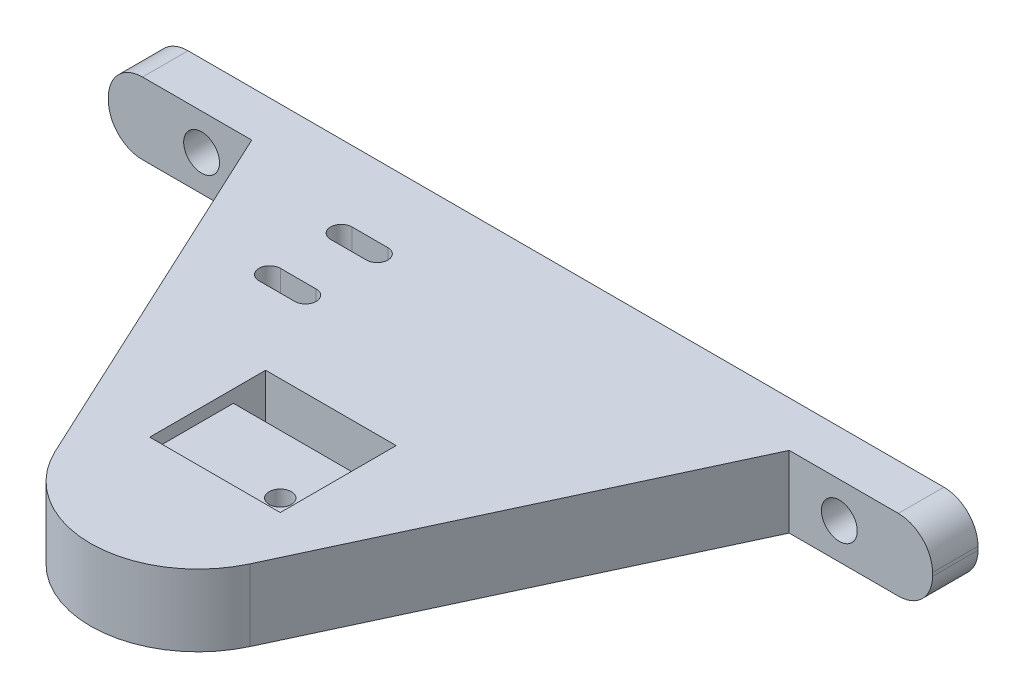
ISO-10303-21;
HEADER;
FILE_DESCRIPTION(('STEP AP214'),'2;1');
FILE_NAME('part.step','',(''),(''),'','','');
FILE_SCHEMA(('AUTOMOTIVE_DESIGN { 1 0 10303 214 1 1 1 1 }'));
ENDSEC;
DATA;
#1=APPLICATION_CONTEXT('core data for automotive mechanical design processes');
#2=APPLICATION_PROTOCOL_DEFINITION('international standard','automotive_design',2000,#1);
#3=PRODUCT_CONTEXT('',#1,'mechanical');
#4=PRODUCT('Part','Part','',(#3));
#5=PRODUCT_RELATED_PRODUCT_CATEGORY('part','',(#4));
#6=PRODUCT_DEFINITION_FORMATION('','',#4);
#7=PRODUCT_DEFINITION_CONTEXT('part definition',#1,'design');
#8=PRODUCT_DEFINITION('design','',#6,#7);
#9=PRODUCT_DEFINITION_SHAPE('','',#8);
#10=(LENGTH_UNIT() NAMED_UNIT(*) SI_UNIT(.MILLI.,.METRE.));
#11=(NAMED_UNIT(*) PLANE_ANGLE_UNIT() SI_UNIT($,.RADIAN.));
#12=(NAMED_UNIT(*) SI_UNIT($,.STERADIAN.) SOLID_ANGLE_UNIT());
#13=UNCERTAINTY_MEASURE_WITH_UNIT(LENGTH_MEASURE(1.E-05),#10,'distance_accuracy_value','');
#14=(GEOMETRIC_REPRESENTATION_CONTEXT(3) GLOBAL_UNCERTAINTY_ASSIGNED_CONTEXT((#13)) GLOBAL_UNIT_ASSIGNED_CONTEXT((#10,
#11,#12)) REPRESENTATION_CONTEXT('',''));
#15=CARTESIAN_POINT('',(0.,0.,0.));
#16=DIRECTION('',(0.,0.,1.));
#17=DIRECTION('',(1.,0.,0.));
#18=AXIS2_PLACEMENT_3D('',#15,#16,#17);
#19=CARTESIAN_POINT('',(0.,5.,6.35));
#20=DIRECTION('',(0.,1.,0.));
#21=DIRECTION('',(-1.,0.,0.));
#22=AXIS2_PLACEMENT_3D('',#19,#20,#21);
#23=PLANE('',#22);
#24=CARTESIAN_POINT('',(-20.000000062,5.00000000000001,11.35));
#25=DIRECTION('',(0.,1.,0.));
#26=DIRECTION('',(-1.,0.,0.));
#27=AXIS2_PLACEMENT_3D('',#24,#25,#26);
#28=CIRCLE('',#27,1.5);
#29=CARTESIAN_POINT('',(-20.000000062,5.00000000000001,9.85));
#30=VERTEX_POINT('',#29);
#31=CARTESIAN_POINT('',(-20.000000062,5.00000000000001,12.85));
#32=VERTEX_POINT('',#31);
#33=EDGE_CURVE('E51',#30,#32,#28,.T.);
#34=ORIENTED_EDGE('',*,*,#33,.F.);
#35=DIRECTION('',(-1.,0.,0.));
#36=VECTOR('',#35,1.);
#37=CARTESIAN_POINT('',(-20.000000062,5.00000000000001,9.85));
#38=LINE('',#37,#36);
#39=CARTESIAN_POINT('',(-15.000000062,5.00000000000001,9.85));
#40=VERTEX_POINT('',#39);
#41=EDGE_CURVE('E230',#40,#30,#38,.T.);
#42=ORIENTED_EDGE('',*,*,#41,.F.);
#43=CARTESIAN_POINT('',(-15.000000062,5.00000000000001,11.35));
#44=DIRECTION('',(0.,1.,0.));
#45=DIRECTION('',(-1.,0.,0.));
#46=AXIS2_PLACEMENT_3D('',#43,#44,#45);
#47=CIRCLE('',#46,1.5);
#48=CARTESIAN_POINT('',(-15.000000062,5.00000000000001,12.85));
#49=VERTEX_POINT('',#48);
#50=EDGE_CURVE('E233',#49,#40,#47,.T.);
#51=ORIENTED_EDGE('',*,*,#50,.F.);
#52=DIRECTION('',(1.,0.,0.));
#53=VECTOR('',#52,1.);
#54=CARTESIAN_POINT('',(-20.000000062,5.00000000000001,12.85));
#55=LINE('',#54,#53);
#56=EDGE_CURVE('E239',#32,#49,#55,.T.);
#57=ORIENTED_EDGE('',*,*,#56,.F.);
#58=EDGE_LOOP('',(#34,#42,#51,#57));
#59=FACE_BOUND('',#58,.T.);
#60=CARTESIAN_POINT('',(-20.000000062,5.00000000000001,21.35));
#61=DIRECTION('',(0.,1.,0.));
#62=DIRECTION('',(-1.,0.,0.));
#63=AXIS2_PLACEMENT_3D('',#60,#61,#62);
#64=CIRCLE('',#63,1.5);
#65=CARTESIAN_POINT('',(-20.000000062,5.00000000000001,19.85));
#66=VERTEX_POINT('',#65);
#67=CARTESIAN_POINT('',(-20.000000062,5.00000000000001,22.85));
#68=VERTEX_POINT('',#67);
#69=EDGE_CURVE('E59',#66,#68,#64,.T.);
#70=ORIENTED_EDGE('',*,*,#69,.F.);
#71=DIRECTION('',(-1.,0.,0.));
#72=VECTOR('',#71,1.);
#73=CARTESIAN_POINT('',(-20.000000062,5.00000000000001,19.85));
#74=LINE('',#73,#72);
#75=CARTESIAN_POINT('',(-15.000000062,5.00000000000001,19.85));
#76=VERTEX_POINT('',#75);
#77=EDGE_CURVE('E254',#76,#66,#74,.T.);
#78=ORIENTED_EDGE('',*,*,#77,.F.);
#79=CARTESIAN_POINT('',(-15.000000062,5.00000000000001,21.35));
#80=DIRECTION('',(0.,1.,0.));
#81=DIRECTION('',(-1.,0.,0.));
#82=AXIS2_PLACEMENT_3D('',#79,#80,#81);
#83=CIRCLE('',#82,1.5);
#84=CARTESIAN_POINT('',(-15.000000062,5.00000000000001,22.85));
#85=VERTEX_POINT('',#84);
#86=EDGE_CURVE('E268',#85,#76,#83,.T.);
#87=ORIENTED_EDGE('',*,*,#86,.F.);
#88=DIRECTION('',(1.,0.,0.));
#89=VECTOR('',#88,1.);
#90=CARTESIAN_POINT('',(-20.000000062,5.00000000000001,22.85));
#91=LINE('',#90,#89);
#92=EDGE_CURVE('E265',#68,#85,#91,.T.);
#93=ORIENTED_EDGE('',*,*,#92,.F.);
#94=EDGE_LOOP('',(#70,#78,#87,#93));
#95=FACE_BOUND('',#94,.T.);
#96=DIRECTION('',(1.,0.,0.));
#97=VECTOR('',#96,1.);
#98=CARTESIAN_POINT('',(0.,5.,6.35));
#99=LINE('',#98,#97);
#100=CARTESIAN_POINT('',(37.500000062,4.99999999999999,6.35));
#101=VERTEX_POINT('',#100);
#102=CARTESIAN_POINT('',(52.737500062,4.99999999999998,6.35));
#103=VERTEX_POINT('',#102);
#104=EDGE_CURVE('E373',#101,#103,#99,.T.);
#105=ORIENTED_EDGE('',*,*,#104,.T.);
#106=DIRECTION('',(0.,0.,-1.));
#107=VECTOR('',#106,1.);
#108=CARTESIAN_POINT('',(52.737500062,4.99999999999998,0.));
#109=LINE('',#108,#107);
#110=CARTESIAN_POINT('',(52.737500062,4.99999999999998,0.));
#111=VERTEX_POINT('',#110);
#112=EDGE_CURVE('E11',#103,#111,#109,.T.);
#113=ORIENTED_EDGE('',*,*,#112,.T.);
#114=DIRECTION('',(1.,0.,0.));
#115=VECTOR('',#114,1.);
#116=CARTESIAN_POINT('',(0.,5.,0.));
#117=LINE('',#116,#115);
#118=CARTESIAN_POINT('',(-52.737500062,5.00000000000002,0.));
#119=VERTEX_POINT('',#118);
#120=EDGE_CURVE('E385',#119,#111,#117,.T.);
#121=ORIENTED_EDGE('',*,*,#120,.F.);
#122=DIRECTION('',(0.,0.,-1.));
#123=VECTOR('',#122,1.);
#124=CARTESIAN_POINT('',(-52.737500062,5.00000000000002,6.35));
#125=LINE('',#124,#123);
#126=CARTESIAN_POINT('',(-52.737500062,5.00000000000002,6.35));
#127=VERTEX_POINT('',#126);
#128=EDGE_CURVE('E44',#119,#127,#125,.F.);
#129=ORIENTED_EDGE('',*,*,#128,.T.);
#130=CARTESIAN_POINT('',(-37.500000062,5.00000000000002,6.35));
#131=VERTEX_POINT('',#130);
#132=EDGE_CURVE('E374',#127,#131,#99,.T.);
#133=ORIENTED_EDGE('',*,*,#132,.T.);
#134=DIRECTION('',(-0.422117577561382,0.,-0.906541091574844));
#135=VECTOR('',#134,1.);
#136=CARTESIAN_POINT('',(-33.2480632052667,5.00000000000002,15.4814735142717));
#137=LINE('',#136,#135);
#138=CARTESIAN_POINT('',(-13.5981163736227,5.00000000000001,57.6817636634207));
#139=VERTEX_POINT('',#138);
#140=EDGE_CURVE('E349',#139,#131,#137,.T.);
#141=ORIENTED_EDGE('',*,*,#140,.F.);
#142=CARTESIAN_POINT('',(0.,5.,51.35));
#143=DIRECTION('',(0.,1.,0.));
#144=DIRECTION('',(-1.,0.,0.));
#145=AXIS2_PLACEMENT_3D('',#142,#143,#144);
#146=CIRCLE('',#145,15.);
#147=CARTESIAN_POINT('',(13.5981163736227,5.,57.6817636634207));
#148=VERTEX_POINT('',#147);
#149=EDGE_CURVE('E340',#139,#148,#146,.T.);
#150=ORIENTED_EDGE('',*,*,#149,.T.);
#151=DIRECTION('',(0.422117577561382,0.,-0.906541091574844));
#152=VECTOR('',#151,1.);
#153=CARTESIAN_POINT('',(33.2480632052667,4.99999999999999,15.4814735142717));
#154=LINE('',#153,#152);
#155=EDGE_CURVE('E350',#148,#101,#154,.T.);
#156=ORIENTED_EDGE('',*,*,#155,.T.);
#157=EDGE_LOOP('',(#105,#113,#121,#129,#133,#141,#150,#156));
#158=FACE_BOUND('',#157,.T.);
#159=DIRECTION('',(0.,0.,-1.));
#160=VECTOR('',#159,1.);
#161=CARTESIAN_POINT('',(-8.715,5.,0.));
#162=LINE('',#161,#160);
#163=CARTESIAN_POINT('',(-8.715,5.,49.375));
#164=VERTEX_POINT('',#163);
#165=CARTESIAN_POINT('',(-8.715,5.,33.195));
#166=VERTEX_POINT('',#165);
#167=EDGE_CURVE('E328',#164,#166,#162,.T.);
#168=ORIENTED_EDGE('',*,*,#167,.T.);
#169=DIRECTION('',(1.,0.,0.));
#170=VECTOR('',#169,1.);
#171=CARTESIAN_POINT('',(0.,5.,33.195));
#172=LINE('',#171,#170);
#173=CARTESIAN_POINT('',(9.505,5.,33.195));
#174=VERTEX_POINT('',#173);
#175=EDGE_CURVE('E290',#166,#174,#172,.T.);
#176=ORIENTED_EDGE('',*,*,#175,.T.);
#177=DIRECTION('',(0.,0.,1.));
#178=VECTOR('',#177,1.);
#179=CARTESIAN_POINT('',(9.505,5.,0.));
#180=LINE('',#179,#178);
#181=CARTESIAN_POINT('',(9.505,5.,49.375));
#182=VERTEX_POINT('',#181);
#183=EDGE_CURVE('E305',#174,#182,#180,.T.);
#184=ORIENTED_EDGE('',*,*,#183,.T.);
#185=DIRECTION('',(-1.,0.,0.));
#186=VECTOR('',#185,1.);
#187=CARTESIAN_POINT('',(0.,5.,49.375));
#188=LINE('',#187,#186);
#189=EDGE_CURVE('E317',#182,#164,#188,.T.);
#190=ORIENTED_EDGE('',*,*,#189,.T.);
#191=EDGE_LOOP('',(#168,#176,#184,#190));
#192=FACE_BOUND('',#191,.T.);
#193=ADVANCED_FACE('F36',(#59,#95,#158,#192),#23,.T.);
#194=CARTESIAN_POINT('',(0.,-4.99999999999998,6.35));
#195=DIRECTION('',(0.,1.,0.));
#196=DIRECTION('',(0.,0.,1.));
#197=AXIS2_PLACEMENT_3D('',#194,#195,#196);
#198=PLANE('',#197);
#199=DIRECTION('',(-1.,0.,0.));
#200=VECTOR('',#199,1.);
#201=CARTESIAN_POINT('',(-20.000000062,-5.00000000000004,9.85));
#202=LINE('',#201,#200);
#203=CARTESIAN_POINT('',(-15.000000062,-5.00000000000004,9.85));
#204=VERTEX_POINT('',#203);
#205=CARTESIAN_POINT('',(-20.000000062,-5.00000000000004,9.85));
#206=VERTEX_POINT('',#205);
#207=EDGE_CURVE('E217',#204,#206,#202,.T.);
#208=ORIENTED_EDGE('',*,*,#207,.T.);
#209=CARTESIAN_POINT('',(-20.000000062,-5.00000000000004,11.35));
#210=DIRECTION('',(0.,1.,0.));
#211=DIRECTION('',(-1.,0.,0.));
#212=AXIS2_PLACEMENT_3D('',#209,#210,#211);
#213=CIRCLE('',#212,1.5);
#214=CARTESIAN_POINT('',(-20.000000062,-5.00000000000004,12.85));
#215=VERTEX_POINT('',#214);
#216=EDGE_CURVE('E211',#206,#215,#213,.T.);
#217=ORIENTED_EDGE('',*,*,#216,.T.);
#218=DIRECTION('',(1.,0.,0.));
#219=VECTOR('',#218,1.);
#220=CARTESIAN_POINT('',(-20.000000062,-5.00000000000004,12.85));
#221=LINE('',#220,#219);
#222=CARTESIAN_POINT('',(-15.000000062,-4.99999999999998,12.85));
#223=VERTEX_POINT('',#222);
#224=EDGE_CURVE('E221',#215,#223,#221,.T.);
#225=ORIENTED_EDGE('',*,*,#224,.T.);
#226=CARTESIAN_POINT('',(-15.000000062,-5.00000000000004,11.35));
#227=DIRECTION('',(0.,1.,0.));
#228=DIRECTION('',(-1.,0.,0.));
#229=AXIS2_PLACEMENT_3D('',#226,#227,#228);
#230=CIRCLE('',#229,1.5);
#231=EDGE_CURVE('E225',#223,#204,#230,.T.);
#232=ORIENTED_EDGE('',*,*,#231,.T.);
#233=EDGE_LOOP('',(#208,#217,#225,#232));
#234=FACE_BOUND('',#233,.T.);
#235=DIRECTION('',(-1.,0.,0.));
#236=VECTOR('',#235,1.);
#237=CARTESIAN_POINT('',(-20.000000062,-5.00000000000004,19.85));
#238=LINE('',#237,#236);
#239=CARTESIAN_POINT('',(-15.000000062,-5.00000000000004,19.85));
#240=VERTEX_POINT('',#239);
#241=CARTESIAN_POINT('',(-20.000000062,-5.00000000000004,19.85));
#242=VERTEX_POINT('',#241);
#243=EDGE_CURVE('E260',#240,#242,#238,.T.);
#244=ORIENTED_EDGE('',*,*,#243,.T.);
#245=CARTESIAN_POINT('',(-20.000000062,-5.00000000000004,21.35));
#246=DIRECTION('',(0.,1.,0.));
#247=DIRECTION('',(-1.,0.,0.));
#248=AXIS2_PLACEMENT_3D('',#245,#246,#247);
#249=CIRCLE('',#248,1.5);
#250=CARTESIAN_POINT('',(-20.000000062,-5.00000000000004,22.85));
#251=VERTEX_POINT('',#250);
#252=EDGE_CURVE('E250',#242,#251,#249,.T.);
#253=ORIENTED_EDGE('',*,*,#252,.T.);
#254=DIRECTION('',(1.,0.,0.));
#255=VECTOR('',#254,1.);
#256=CARTESIAN_POINT('',(-20.000000062,-5.00000000000004,22.85));
#257=LINE('',#256,#255);
#258=CARTESIAN_POINT('',(-15.000000062,-4.99999999999998,22.85));
#259=VERTEX_POINT('',#258);
#260=EDGE_CURVE('E253',#251,#259,#257,.T.);
#261=ORIENTED_EDGE('',*,*,#260,.T.);
#262=CARTESIAN_POINT('',(-15.000000062,-5.00000000000004,21.35));
#263=DIRECTION('',(0.,1.,0.));
#264=DIRECTION('',(-1.,0.,0.));
#265=AXIS2_PLACEMENT_3D('',#262,#263,#264);
#266=CIRCLE('',#265,1.5);
#267=EDGE_CURVE('E257',#259,#240,#266,.T.);
#268=ORIENTED_EDGE('',*,*,#267,.T.);
#269=EDGE_LOOP('',(#244,#253,#261,#268));
#270=FACE_BOUND('',#269,.T.);
#271=DIRECTION('',(1.,0.,0.));
#272=VECTOR('',#271,1.);
#273=CARTESIAN_POINT('',(0.,-4.99999999999998,6.35));
#274=LINE('',#273,#272);
#275=CARTESIAN_POINT('',(-52.737500062,-4.99999999999998,6.35));
#276=VERTEX_POINT('',#275);
#277=CARTESIAN_POINT('',(-37.500000062,-4.99999999999998,6.35));
#278=VERTEX_POINT('',#277);
#279=EDGE_CURVE('E367',#276,#278,#274,.T.);
#280=ORIENTED_EDGE('',*,*,#279,.F.);
#281=DIRECTION('',(0.,0.,-1.));
#282=VECTOR('',#281,1.);
#283=CARTESIAN_POINT('',(-52.737500062,-4.99999999999998,0.));
#284=LINE('',#283,#282);
#285=CARTESIAN_POINT('',(-52.737500062,-4.99999999999998,0.));
#286=VERTEX_POINT('',#285);
#287=EDGE_CURVE('E394',#276,#286,#284,.T.);
#288=ORIENTED_EDGE('',*,*,#287,.T.);
#289=DIRECTION('',(1.,0.,0.));
#290=VECTOR('',#289,1.);
#291=CARTESIAN_POINT('',(0.,-4.99999999999998,0.));
#292=LINE('',#291,#290);
#293=CARTESIAN_POINT('',(52.737500062,-4.99999999999998,0.));
#294=VERTEX_POINT('',#293);
#295=EDGE_CURVE('E354',#286,#294,#292,.T.);
#296=ORIENTED_EDGE('',*,*,#295,.T.);
#297=DIRECTION('',(0.,0.,-1.));
#298=VECTOR('',#297,1.);
#299=CARTESIAN_POINT('',(52.737500062,-4.99999999999998,6.35));
#300=LINE('',#299,#298);
#301=CARTESIAN_POINT('',(52.737500062,-4.99999999999998,6.35));
#302=VERTEX_POINT('',#301);
#303=EDGE_CURVE('E379',#294,#302,#300,.F.);
#304=ORIENTED_EDGE('',*,*,#303,.T.);
#305=CARTESIAN_POINT('',(37.500000062,-4.99999999999998,6.35));
#306=VERTEX_POINT('',#305);
#307=EDGE_CURVE('E370',#306,#302,#274,.T.);
#308=ORIENTED_EDGE('',*,*,#307,.F.);
#309=DIRECTION('',(0.422117577561382,0.,-0.906541091574844));
#310=VECTOR('',#309,1.);
#311=CARTESIAN_POINT('',(33.2480632052667,-4.99999999999998,15.4814735142717));
#312=LINE('',#311,#310);
#313=CARTESIAN_POINT('',(13.5981163736227,-4.99999999999998,57.6817636634207));
#314=VERTEX_POINT('',#313);
#315=EDGE_CURVE('E341',#314,#306,#312,.T.);
#316=ORIENTED_EDGE('',*,*,#315,.F.);
#317=CARTESIAN_POINT('',(0.,-4.99999999999998,51.35));
#318=DIRECTION('',(0.,-1.,0.));
#319=DIRECTION('',(0.,0.,-1.));
#320=AXIS2_PLACEMENT_3D('',#317,#318,#319);
#321=CIRCLE('',#320,15.);
#322=CARTESIAN_POINT('',(-13.5981163736227,-4.99999999999998,57.6817636634207));
#323=VERTEX_POINT('',#322);
#324=EDGE_CURVE('E351',#323,#314,#321,.F.);
#325=ORIENTED_EDGE('',*,*,#324,.F.);
#326=DIRECTION('',(-0.422117577561382,0.,-0.906541091574844));
#327=VECTOR('',#326,1.);
#328=CARTESIAN_POINT('',(-33.2480632052667,-4.99999999999998,15.4814735142717));
#329=LINE('',#328,#327);
#330=EDGE_CURVE('E346',#323,#278,#329,.T.);
#331=ORIENTED_EDGE('',*,*,#330,.T.);
#332=EDGE_LOOP('',(#280,#288,#296,#304,#308,#316,#325,#331));
#333=FACE_BOUND('',#332,.T.);
#334=CARTESIAN_POINT('',(6.005,-5.,45.875));
#335=DIRECTION('',(0.,1.,0.));
#336=DIRECTION('',(0.,0.,1.));
#337=AXIS2_PLACEMENT_3D('',#334,#335,#336);
#338=CIRCLE('',#337,1.55);
#339=CARTESIAN_POINT('',(6.005,-5.,47.425));
#340=VERTEX_POINT('',#339);
#341=EDGE_CURVE('E337',#340,#340,#338,.T.);
#342=ORIENTED_EDGE('',*,*,#341,.T.);
#343=EDGE_LOOP('',(#342));
#344=FACE_BOUND('',#343,.T.);
#345=DIRECTION('',(-1.,0.,0.));
#346=VECTOR('',#345,1.);
#347=CARTESIAN_POINT('',(0.,-5.00000000000002,37.695));
#348=LINE('',#347,#346);
#349=CARTESIAN_POINT('',(9.505,-5.00000000000003,37.695));
#350=VERTEX_POINT('',#349);
#351=CARTESIAN_POINT('',(-8.715,-5.00000000000002,37.695));
#352=VERTEX_POINT('',#351);
#353=EDGE_CURVE('E291',#350,#352,#348,.T.);
#354=ORIENTED_EDGE('',*,*,#353,.F.);
#355=DIRECTION('',(0.,0.,1.));
#356=VECTOR('',#355,1.);
#357=CARTESIAN_POINT('',(9.50499999999999,-5.00000000000003,0.));
#358=LINE('',#357,#356);
#359=CARTESIAN_POINT('',(9.505,-4.99999999999998,33.195));
#360=VERTEX_POINT('',#359);
#361=EDGE_CURVE('E293',#360,#350,#358,.T.);
#362=ORIENTED_EDGE('',*,*,#361,.F.);
#363=DIRECTION('',(1.,0.,0.));
#364=VECTOR('',#363,1.);
#365=CARTESIAN_POINT('',(0.,-5.00000000000002,33.195));
#366=LINE('',#365,#364);
#367=CARTESIAN_POINT('',(-8.715,-5.00000000000002,33.195));
#368=VERTEX_POINT('',#367);
#369=EDGE_CURVE('E295',#368,#360,#366,.T.);
#370=ORIENTED_EDGE('',*,*,#369,.F.);
#371=DIRECTION('',(0.,0.,-1.));
#372=VECTOR('',#371,1.);
#373=CARTESIAN_POINT('',(-8.71500000000001,-5.00000000000002,0.));
#374=LINE('',#373,#372);
#375=EDGE_CURVE('E298',#352,#368,#374,.T.);
#376=ORIENTED_EDGE('',*,*,#375,.F.);
#377=EDGE_LOOP('',(#354,#362,#370,#376));
#378=FACE_BOUND('',#377,.T.);
#379=ADVANCED_FACE('F227',(#234,#270,#333,#344,#378),#198,.F.);
#380=CARTESIAN_POINT('',(6.005,5.,45.875));
#381=DIRECTION('',(0.,1.,0.));
#382=DIRECTION('',(0.,0.,1.));
#383=AXIS2_PLACEMENT_3D('',#380,#381,#382);
#384=CYLINDRICAL_SURFACE('',#383,1.55);
#385=ORIENTED_EDGE('',*,*,#341,.F.);
#386=EDGE_LOOP('',(#385));
#387=FACE_BOUND('',#386,.T.);
#388=CARTESIAN_POINT('',(6.005,3.25,45.875));
#389=DIRECTION('',(0.,1.,0.));
#390=DIRECTION('',(-1.,0.,0.));
#391=AXIS2_PLACEMENT_3D('',#388,#389,#390);
#392=CIRCLE('',#391,1.55);
#393=CARTESIAN_POINT('',(4.455,3.25,45.875));
#394=VERTEX_POINT('',#393);
#395=EDGE_CURVE('E335',#394,#394,#392,.F.);
#396=ORIENTED_EDGE('',*,*,#395,.F.);
#397=EDGE_LOOP('',(#396));
#398=FACE_BOUND('',#397,.T.);
#399=ADVANCED_FACE('F482',(#387,#398),#384,.F.);
#400=CARTESIAN_POINT('',(0.,0.,6.35));
#401=DIRECTION('',(0.,0.,1.));
#402=DIRECTION('',(1.,0.,0.));
#403=AXIS2_PLACEMENT_3D('',#400,#401,#402);
#404=PLANE('',#403);
#405=CARTESIAN_POINT('',(44.5,0.,6.35));
#406=DIRECTION('',(0.,0.,1.));
#407=DIRECTION('',(1.,0.,0.));
#408=AXIS2_PLACEMENT_3D('',#405,#406,#407);
#409=CIRCLE('',#408,2.5);
#410=CARTESIAN_POINT('',(47.,0.,6.35));
#411=VERTEX_POINT('',#410);
#412=EDGE_CURVE('E246',#411,#411,#409,.T.);
#413=ORIENTED_EDGE('',*,*,#412,.F.);
#414=EDGE_LOOP('',(#413));
#415=FACE_BOUND('',#414,.T.);
#416=ORIENTED_EDGE('',*,*,#307,.T.);
#417=CARTESIAN_POINT('',(52.737500062,-0.237499999999977,6.35));
#418=DIRECTION('',(0.,0.,1.));
#419=DIRECTION('',(1.,0.,0.));
#420=AXIS2_PLACEMENT_3D('',#417,#418,#419);
#421=CIRCLE('',#420,4.7625);
#422=CARTESIAN_POINT('',(57.500000062,-0.237499999999977,6.35));
#423=VERTEX_POINT('',#422);
#424=EDGE_CURVE('E421',#302,#423,#421,.T.);
#425=ORIENTED_EDGE('',*,*,#424,.T.);
#426=DIRECTION('',(0.,1.,0.));
#427=VECTOR('',#426,1.);
#428=CARTESIAN_POINT('',(57.500000062,0.,6.35));
#429=LINE('',#428,#427);
#430=CARTESIAN_POINT('',(57.500000062,0.237499999999979,6.35));
#431=VERTEX_POINT('',#430);
#432=EDGE_CURVE('E369',#423,#431,#429,.T.);
#433=ORIENTED_EDGE('',*,*,#432,.T.);
#434=CARTESIAN_POINT('',(52.737500062,0.237499999999979,6.35));
#435=DIRECTION('',(0.,0.,1.));
#436=DIRECTION('',(1.,0.,0.));
#437=AXIS2_PLACEMENT_3D('',#434,#435,#436);
#438=CIRCLE('',#437,4.7625);
#439=EDGE_CURVE('E419',#431,#103,#438,.T.);
#440=ORIENTED_EDGE('',*,*,#439,.T.);
#441=ORIENTED_EDGE('',*,*,#104,.F.);
#442=DIRECTION('',(0.,-1.,0.));
#443=VECTOR('',#442,1.);
#444=CARTESIAN_POINT('',(37.500000062,101.04686365832,6.35));
#445=LINE('',#444,#443);
#446=EDGE_CURVE('E362',#101,#306,#445,.T.);
#447=ORIENTED_EDGE('',*,*,#446,.T.);
#448=EDGE_LOOP('',(#416,#425,#433,#440,#441,#447));
#449=FACE_BOUND('',#448,.T.);
#450=ADVANCED_FACE('F480',(#415,#449),#404,.T.);
#451=CARTESIAN_POINT('',(57.500000062,0.,6.35));
#452=DIRECTION('',(-1.,0.,0.));
#453=DIRECTION('',(0.,0.,1.));
#454=AXIS2_PLACEMENT_3D('',#451,#452,#453);
#455=PLANE('',#454);
#456=ORIENTED_EDGE('',*,*,#432,.F.);
#457=DIRECTION('',(0.,0.,-1.));
#458=VECTOR('',#457,1.);
#459=CARTESIAN_POINT('',(57.500000062,-0.237499999999977,6.35));
#460=LINE('',#459,#458);
#461=CARTESIAN_POINT('',(57.500000062,-0.237499999999977,0.));
#462=VERTEX_POINT('',#461);
#463=EDGE_CURVE('E416',#423,#462,#460,.T.);
#464=ORIENTED_EDGE('',*,*,#463,.T.);
#465=DIRECTION('',(0.,1.,0.));
#466=VECTOR('',#465,1.);
#467=CARTESIAN_POINT('',(57.500000062,0.,0.));
#468=LINE('',#467,#466);
#469=CARTESIAN_POINT('',(57.500000062,0.237499999999979,0.));
#470=VERTEX_POINT('',#469);
#471=EDGE_CURVE('E382',#462,#470,#468,.T.);
#472=ORIENTED_EDGE('',*,*,#471,.T.);
#473=DIRECTION('',(0.,0.,-1.));
#474=VECTOR('',#473,1.);
#475=CARTESIAN_POINT('',(57.500000062,0.237499999999979,6.35));
#476=LINE('',#475,#474);
#477=EDGE_CURVE('E414',#470,#431,#476,.F.);
#478=ORIENTED_EDGE('',*,*,#477,.T.);
#479=EDGE_LOOP('',(#456,#464,#472,#478));
#480=FACE_BOUND('',#479,.T.);
#481=ADVANCED_FACE('F473',(#480),#455,.F.);
#482=CARTESIAN_POINT('',(-57.500000062,0.,6.35));
#483=DIRECTION('',(-1.,0.,0.));
#484=DIRECTION('',(0.,0.,1.));
#485=AXIS2_PLACEMENT_3D('',#482,#483,#484);
#486=PLANE('',#485);
#487=DIRECTION('',(0.,1.,0.));
#488=VECTOR('',#487,1.);
#489=CARTESIAN_POINT('',(-57.500000062,0.,0.));
#490=LINE('',#489,#488);
#491=CARTESIAN_POINT('',(-57.500000062,-0.237499999999977,0.));
#492=VERTEX_POINT('',#491);
#493=CARTESIAN_POINT('',(-57.500000062,0.237500000000021,0.));
#494=VERTEX_POINT('',#493);
#495=EDGE_CURVE('E388',#492,#494,#490,.T.);
#496=ORIENTED_EDGE('',*,*,#495,.F.);
#497=DIRECTION('',(0.,0.,-1.));
#498=VECTOR('',#497,1.);
#499=CARTESIAN_POINT('',(-57.500000062,-0.237499999999977,6.35));
#500=LINE('',#499,#498);
#501=CARTESIAN_POINT('',(-57.500000062,-0.237499999999977,6.35));
#502=VERTEX_POINT('',#501);
#503=EDGE_CURVE('E408',#492,#502,#500,.F.);
#504=ORIENTED_EDGE('',*,*,#503,.T.);
#505=DIRECTION('',(0.,1.,0.));
#506=VECTOR('',#505,1.);
#507=CARTESIAN_POINT('',(-57.500000062,0.,6.35));
#508=LINE('',#507,#506);
#509=CARTESIAN_POINT('',(-57.500000062,0.237500000000021,6.35));
#510=VERTEX_POINT('',#509);
#511=EDGE_CURVE('E376',#502,#510,#508,.T.);
#512=ORIENTED_EDGE('',*,*,#511,.T.);
#513=DIRECTION('',(0.,0.,-1.));
#514=VECTOR('',#513,1.);
#515=CARTESIAN_POINT('',(-57.500000062,0.237500000000021,6.35));
#516=LINE('',#515,#514);
#517=EDGE_CURVE('E405',#510,#494,#516,.T.);
#518=ORIENTED_EDGE('',*,*,#517,.T.);
#519=EDGE_LOOP('',(#496,#504,#512,#518));
#520=FACE_BOUND('',#519,.T.);
#521=ADVANCED_FACE('F437',(#520),#486,.T.);
#522=CARTESIAN_POINT('',(-44.5,0.,6.35));
#523=DIRECTION('',(0.,0.,1.));
#524=DIRECTION('',(1.,0.,0.));
#525=AXIS2_PLACEMENT_3D('',#522,#523,#524);
#526=CIRCLE('',#525,2.5);
#527=CARTESIAN_POINT('',(-42.,0.,6.35));
#528=VERTEX_POINT('',#527);
#529=EDGE_CURVE('E284',#528,#528,#526,.T.);
#530=ORIENTED_EDGE('',*,*,#529,.F.);
#531=EDGE_LOOP('',(#530));
#532=FACE_BOUND('',#531,.T.);
#533=ORIENTED_EDGE('',*,*,#511,.F.);
#534=CARTESIAN_POINT('',(-52.737500062,-0.237499999999977,6.35));
#535=DIRECTION('',(0.,0.,1.));
#536=DIRECTION('',(1.,0.,0.));
#537=AXIS2_PLACEMENT_3D('',#534,#535,#536);
#538=CIRCLE('',#537,4.7625);
#539=EDGE_CURVE('E412',#502,#276,#538,.T.);
#540=ORIENTED_EDGE('',*,*,#539,.T.);
#541=ORIENTED_EDGE('',*,*,#279,.T.);
#542=DIRECTION('',(0.,-1.,0.));
#543=VECTOR('',#542,1.);
#544=CARTESIAN_POINT('',(-37.500000062,101.04686365832,6.35));
#545=LINE('',#544,#543);
#546=EDGE_CURVE('E357',#131,#278,#545,.T.);
#547=ORIENTED_EDGE('',*,*,#546,.F.);
#548=ORIENTED_EDGE('',*,*,#132,.F.);
#549=CARTESIAN_POINT('',(-52.737500062,0.237500000000021,6.35));
#550=DIRECTION('',(0.,0.,1.));
#551=DIRECTION('',(1.,0.,0.));
#552=AXIS2_PLACEMENT_3D('',#549,#550,#551);
#553=CIRCLE('',#552,4.7625);
#554=EDGE_CURVE('E410',#127,#510,#553,.T.);
#555=ORIENTED_EDGE('',*,*,#554,.T.);
#556=EDGE_LOOP('',(#533,#540,#541,#547,#548,#555));
#557=FACE_BOUND('',#556,.T.);
#558=ADVANCED_FACE('F433',(#532,#557),#404,.T.);
#559=CARTESIAN_POINT('',(0.,0.,0.));
#560=DIRECTION('',(0.,0.,1.));
#561=DIRECTION('',(1.,0.,0.));
#562=AXIS2_PLACEMENT_3D('',#559,#560,#561);
#563=PLANE('',#562);
#564=CARTESIAN_POINT('',(44.5,0.,0.));
#565=DIRECTION('',(0.,0.,1.));
#566=DIRECTION('',(1.,0.,0.));
#567=AXIS2_PLACEMENT_3D('',#564,#565,#566);
#568=CIRCLE('',#567,2.5);
#569=CARTESIAN_POINT('',(47.,0.,0.));
#570=VERTEX_POINT('',#569);
#571=EDGE_CURVE('E281',#570,#570,#568,.T.);
#572=ORIENTED_EDGE('',*,*,#571,.T.);
#573=EDGE_LOOP('',(#572));
#574=FACE_BOUND('',#573,.T.);
#575=CARTESIAN_POINT('',(-44.5,0.,0.));
#576=DIRECTION('',(0.,0.,1.));
#577=DIRECTION('',(1.,0.,0.));
#578=AXIS2_PLACEMENT_3D('',#575,#576,#577);
#579=CIRCLE('',#578,2.5);
#580=CARTESIAN_POINT('',(-42.,0.,0.));
#581=VERTEX_POINT('',#580);
#582=EDGE_CURVE('E287',#581,#581,#579,.T.);
#583=ORIENTED_EDGE('',*,*,#582,.T.);
#584=EDGE_LOOP('',(#583));
#585=FACE_BOUND('',#584,.T.);
#586=ORIENTED_EDGE('',*,*,#295,.F.);
#587=CARTESIAN_POINT('',(-52.737500062,-0.237499999999977,0.));
#588=DIRECTION('',(0.,0.,1.));
#589=DIRECTION('',(1.,0.,0.));
#590=AXIS2_PLACEMENT_3D('',#587,#588,#589);
#591=CIRCLE('',#590,4.7625);
#592=EDGE_CURVE('E403',#286,#492,#591,.F.);
#593=ORIENTED_EDGE('',*,*,#592,.T.);
#594=ORIENTED_EDGE('',*,*,#495,.T.);
#595=CARTESIAN_POINT('',(-52.737500062,0.237500000000021,0.));
#596=DIRECTION('',(0.,0.,1.));
#597=DIRECTION('',(1.,0.,0.));
#598=AXIS2_PLACEMENT_3D('',#595,#596,#597);
#599=CIRCLE('',#598,4.7625);
#600=EDGE_CURVE('E397',#494,#119,#599,.F.);
#601=ORIENTED_EDGE('',*,*,#600,.T.);
#602=ORIENTED_EDGE('',*,*,#120,.T.);
#603=CARTESIAN_POINT('',(52.737500062,0.237499999999979,0.));
#604=DIRECTION('',(0.,0.,1.));
#605=DIRECTION('',(1.,0.,0.));
#606=AXIS2_PLACEMENT_3D('',#603,#604,#605);
#607=CIRCLE('',#606,4.7625);
#608=EDGE_CURVE('E399',#111,#470,#607,.F.);
#609=ORIENTED_EDGE('',*,*,#608,.T.);
#610=ORIENTED_EDGE('',*,*,#471,.F.);
#611=CARTESIAN_POINT('',(52.737500062,-0.237499999999977,0.));
#612=DIRECTION('',(0.,0.,1.));
#613=DIRECTION('',(1.,0.,0.));
#614=AXIS2_PLACEMENT_3D('',#611,#612,#613);
#615=CIRCLE('',#614,4.7625);
#616=EDGE_CURVE('E401',#462,#294,#615,.F.);
#617=ORIENTED_EDGE('',*,*,#616,.T.);
#618=EDGE_LOOP('',(#586,#593,#594,#601,#602,#609,#610,#617));
#619=FACE_BOUND('',#618,.T.);
#620=ADVANCED_FACE('F441',(#574,#585,#619),#563,.F.);
#621=CARTESIAN_POINT('',(-33.2480632052667,101.04686365832,15.4814735142717));
#622=DIRECTION('',(-0.906541091574844,0.,0.422117577561382));
#623=DIRECTION('',(0.422117577561382,0.,0.906541091574844));
#624=AXIS2_PLACEMENT_3D('',#621,#622,#623);
#625=PLANE('',#624);
#626=DIRECTION('',(0.,-1.,0.));
#627=VECTOR('',#626,1.);
#628=CARTESIAN_POINT('',(-13.5981163736227,101.04686365832,57.6817636634207));
#629=LINE('',#628,#627);
#630=EDGE_CURVE('E344',#139,#323,#629,.T.);
#631=ORIENTED_EDGE('',*,*,#630,.F.);
#632=ORIENTED_EDGE('',*,*,#140,.T.);
#633=ORIENTED_EDGE('',*,*,#546,.T.);
#634=ORIENTED_EDGE('',*,*,#330,.F.);
#635=EDGE_LOOP('',(#631,#632,#633,#634));
#636=FACE_BOUND('',#635,.T.);
#637=ADVANCED_FACE('F454',(#636),#625,.T.);
#638=CARTESIAN_POINT('',(33.2480632052667,101.04686365832,15.4814735142717));
#639=DIRECTION('',(-0.906541091574844,0.,-0.422117577561382));
#640=DIRECTION('',(-0.422117577561382,0.,0.906541091574844));
#641=AXIS2_PLACEMENT_3D('',#638,#639,#640);
#642=PLANE('',#641);
#643=ORIENTED_EDGE('',*,*,#155,.F.);
#644=DIRECTION('',(0.,-1.,0.));
#645=VECTOR('',#644,1.);
#646=CARTESIAN_POINT('',(13.5981163736227,101.04686365832,57.6817636634207));
#647=LINE('',#646,#645);
#648=EDGE_CURVE('E345',#148,#314,#647,.T.);
#649=ORIENTED_EDGE('',*,*,#648,.T.);
#650=ORIENTED_EDGE('',*,*,#315,.T.);
#651=ORIENTED_EDGE('',*,*,#446,.F.);
#652=EDGE_LOOP('',(#643,#649,#650,#651));
#653=FACE_BOUND('',#652,.T.);
#654=ADVANCED_FACE('F463',(#653),#642,.F.);
#655=CARTESIAN_POINT('',(0.,101.04686365832,51.35));
#656=DIRECTION('',(0.,-1.,0.));
#657=DIRECTION('',(0.,0.,-1.));
#658=AXIS2_PLACEMENT_3D('',#655,#656,#657);
#659=CYLINDRICAL_SURFACE('',#658,15.);
#660=ORIENTED_EDGE('',*,*,#149,.F.);
#661=ORIENTED_EDGE('',*,*,#630,.T.);
#662=ORIENTED_EDGE('',*,*,#324,.T.);
#663=ORIENTED_EDGE('',*,*,#648,.F.);
#664=EDGE_LOOP('',(#660,#661,#662,#663));
#665=FACE_BOUND('',#664,.T.);
#666=ADVANCED_FACE('F458',(#665),#659,.T.);
#667=CARTESIAN_POINT('',(0.,3.25,0.));
#668=DIRECTION('',(0.,1.,0.));
#669=DIRECTION('',(-1.,0.,0.));
#670=AXIS2_PLACEMENT_3D('',#667,#668,#669);
#671=PLANE('',#670);
#672=DIRECTION('',(0.,0.,1.));
#673=VECTOR('',#672,1.);
#674=CARTESIAN_POINT('',(9.505,3.25,0.));
#675=LINE('',#674,#673);
#676=CARTESIAN_POINT('',(9.505,3.25,37.695));
#677=VERTEX_POINT('',#676);
#678=CARTESIAN_POINT('',(9.505,3.25,49.375));
#679=VERTEX_POINT('',#678);
#680=EDGE_CURVE('E313',#677,#679,#675,.T.);
#681=ORIENTED_EDGE('',*,*,#680,.F.);
#682=DIRECTION('',(-1.,0.,0.));
#683=VECTOR('',#682,1.);
#684=CARTESIAN_POINT('',(0.,3.25,37.695));
#685=LINE('',#684,#683);
#686=CARTESIAN_POINT('',(-8.715,3.25,37.695));
#687=VERTEX_POINT('',#686);
#688=EDGE_CURVE('E316',#677,#687,#685,.T.);
#689=ORIENTED_EDGE('',*,*,#688,.T.);
#690=DIRECTION('',(0.,0.,-1.));
#691=VECTOR('',#690,1.);
#692=CARTESIAN_POINT('',(-8.715,3.25,0.));
#693=LINE('',#692,#691);
#694=CARTESIAN_POINT('',(-8.715,3.25,49.375));
#695=VERTEX_POINT('',#694);
#696=EDGE_CURVE('E320',#695,#687,#693,.T.);
#697=ORIENTED_EDGE('',*,*,#696,.F.);
#698=DIRECTION('',(-1.,0.,0.));
#699=VECTOR('',#698,1.);
#700=CARTESIAN_POINT('',(0.,3.25,49.375));
#701=LINE('',#700,#699);
#702=EDGE_CURVE('E323',#679,#695,#701,.T.);
#703=ORIENTED_EDGE('',*,*,#702,.F.);
#704=EDGE_LOOP('',(#681,#689,#697,#703));
#705=FACE_BOUND('',#704,.T.);
#706=ORIENTED_EDGE('',*,*,#395,.T.);
#707=EDGE_LOOP('',(#706));
#708=FACE_BOUND('',#707,.T.);
#709=ADVANCED_FACE('F540',(#705,#708),#671,.T.);
#710=CARTESIAN_POINT('',(9.505,3.25,0.));
#711=DIRECTION('',(-1.,0.,0.));
#712=DIRECTION('',(0.,-1.,0.));
#713=AXIS2_PLACEMENT_3D('',#710,#711,#712);
#714=PLANE('',#713);
#715=ORIENTED_EDGE('',*,*,#183,.F.);
#716=DIRECTION('',(0.,1.,0.));
#717=VECTOR('',#716,1.);
#718=CARTESIAN_POINT('',(9.505,-5.00000000000003,33.195));
#719=LINE('',#718,#717);
#720=EDGE_CURVE('E309',#360,#174,#719,.T.);
#721=ORIENTED_EDGE('',*,*,#720,.F.);
#722=ORIENTED_EDGE('',*,*,#361,.T.);
#723=DIRECTION('',(0.,1.,0.));
#724=VECTOR('',#723,1.);
#725=CARTESIAN_POINT('',(9.505,-5.00000000000003,37.695));
#726=LINE('',#725,#724);
#727=EDGE_CURVE('E300',#350,#677,#726,.T.);
#728=ORIENTED_EDGE('',*,*,#727,.T.);
#729=ORIENTED_EDGE('',*,*,#680,.T.);
#730=DIRECTION('',(0.,1.,0.));
#731=VECTOR('',#730,1.);
#732=CARTESIAN_POINT('',(9.505,3.25,49.375));
#733=LINE('',#732,#731);
#734=EDGE_CURVE('E332',#679,#182,#733,.T.);
#735=ORIENTED_EDGE('',*,*,#734,.T.);
#736=EDGE_LOOP('',(#715,#721,#722,#728,#729,#735));
#737=FACE_BOUND('',#736,.T.);
#738=ADVANCED_FACE('F543',(#737),#714,.T.);
#739=CARTESIAN_POINT('',(0.,3.25,49.375));
#740=DIRECTION('',(0.,0.,-1.));
#741=DIRECTION('',(-1.,0.,0.));
#742=AXIS2_PLACEMENT_3D('',#739,#740,#741);
#743=PLANE('',#742);
#744=ORIENTED_EDGE('',*,*,#189,.F.);
#745=ORIENTED_EDGE('',*,*,#734,.F.);
#746=ORIENTED_EDGE('',*,*,#702,.T.);
#747=DIRECTION('',(0.,1.,0.));
#748=VECTOR('',#747,1.);
#749=CARTESIAN_POINT('',(-8.715,3.25,49.375));
#750=LINE('',#749,#748);
#751=EDGE_CURVE('E325',#695,#164,#750,.T.);
#752=ORIENTED_EDGE('',*,*,#751,.T.);
#753=EDGE_LOOP('',(#744,#745,#746,#752));
#754=FACE_BOUND('',#753,.T.);
#755=ADVANCED_FACE('F545',(#754),#743,.T.);
#756=CARTESIAN_POINT('',(-8.715,3.25,0.));
#757=DIRECTION('',(1.,0.,0.));
#758=DIRECTION('',(0.,1.,0.));
#759=AXIS2_PLACEMENT_3D('',#756,#757,#758);
#760=PLANE('',#759);
#761=ORIENTED_EDGE('',*,*,#167,.F.);
#762=ORIENTED_EDGE('',*,*,#751,.F.);
#763=ORIENTED_EDGE('',*,*,#696,.T.);
#764=DIRECTION('',(0.,1.,0.));
#765=VECTOR('',#764,1.);
#766=CARTESIAN_POINT('',(-8.715,-5.00000000000002,37.695));
#767=LINE('',#766,#765);
#768=EDGE_CURVE('E303',#352,#687,#767,.T.);
#769=ORIENTED_EDGE('',*,*,#768,.F.);
#770=ORIENTED_EDGE('',*,*,#375,.T.);
#771=DIRECTION('',(0.,1.,0.));
#772=VECTOR('',#771,1.);
#773=CARTESIAN_POINT('',(-8.715,-5.00000000000002,33.195));
#774=LINE('',#773,#772);
#775=EDGE_CURVE('E306',#368,#166,#774,.T.);
#776=ORIENTED_EDGE('',*,*,#775,.T.);
#777=EDGE_LOOP('',(#761,#762,#763,#769,#770,#776));
#778=FACE_BOUND('',#777,.T.);
#779=ADVANCED_FACE('F538',(#778),#760,.T.);
#780=CARTESIAN_POINT('',(0.,-5.00000000000002,37.695));
#781=DIRECTION('',(0.,0.,-1.));
#782=DIRECTION('',(-1.,0.,0.));
#783=AXIS2_PLACEMENT_3D('',#780,#781,#782);
#784=PLANE('',#783);
#785=ORIENTED_EDGE('',*,*,#727,.F.);
#786=ORIENTED_EDGE('',*,*,#353,.T.);
#787=ORIENTED_EDGE('',*,*,#768,.T.);
#788=ORIENTED_EDGE('',*,*,#688,.F.);
#789=EDGE_LOOP('',(#785,#786,#787,#788));
#790=FACE_BOUND('',#789,.T.);
#791=ADVANCED_FACE('F534',(#790),#784,.T.);
#792=CARTESIAN_POINT('',(0.,-5.00000000000002,33.195));
#793=DIRECTION('',(0.,0.,1.));
#794=DIRECTION('',(1.,0.,0.));
#795=AXIS2_PLACEMENT_3D('',#792,#793,#794);
#796=PLANE('',#795);
#797=ORIENTED_EDGE('',*,*,#175,.F.);
#798=ORIENTED_EDGE('',*,*,#775,.F.);
#799=ORIENTED_EDGE('',*,*,#369,.T.);
#800=ORIENTED_EDGE('',*,*,#720,.T.);
#801=EDGE_LOOP('',(#797,#798,#799,#800));
#802=FACE_BOUND('',#801,.T.);
#803=ADVANCED_FACE('F509',(#802),#796,.T.);
#804=CARTESIAN_POINT('',(-52.737500062,-0.237499999999977,6.35));
#805=DIRECTION('',(0.,0.,1.));
#806=DIRECTION('',(1.,0.,0.));
#807=AXIS2_PLACEMENT_3D('',#804,#805,#806);
#808=CYLINDRICAL_SURFACE('',#807,4.7625);
#809=ORIENTED_EDGE('',*,*,#539,.F.);
#810=ORIENTED_EDGE('',*,*,#503,.F.);
#811=ORIENTED_EDGE('',*,*,#592,.F.);
#812=ORIENTED_EDGE('',*,*,#287,.F.);
#813=EDGE_LOOP('',(#809,#810,#811,#812));
#814=FACE_BOUND('',#813,.T.);
#815=ADVANCED_FACE('F445',(#814),#808,.T.);
#816=CARTESIAN_POINT('',(52.737500062,-0.237499999999977,6.35));
#817=DIRECTION('',(0.,0.,-1.));
#818=DIRECTION('',(-1.,0.,0.));
#819=AXIS2_PLACEMENT_3D('',#816,#817,#818);
#820=CYLINDRICAL_SURFACE('',#819,4.7625);
#821=ORIENTED_EDGE('',*,*,#424,.F.);
#822=ORIENTED_EDGE('',*,*,#303,.F.);
#823=ORIENTED_EDGE('',*,*,#616,.F.);
#824=ORIENTED_EDGE('',*,*,#463,.F.);
#825=EDGE_LOOP('',(#821,#822,#823,#824));
#826=FACE_BOUND('',#825,.T.);
#827=ADVANCED_FACE('F477',(#826),#820,.T.);
#828=CARTESIAN_POINT('',(52.737500062,0.237499999999979,6.35));
#829=DIRECTION('',(0.,0.,1.));
#830=DIRECTION('',(1.,0.,0.));
#831=AXIS2_PLACEMENT_3D('',#828,#829,#830);
#832=CYLINDRICAL_SURFACE('',#831,4.7625);
#833=ORIENTED_EDGE('',*,*,#439,.F.);
#834=ORIENTED_EDGE('',*,*,#477,.F.);
#835=ORIENTED_EDGE('',*,*,#608,.F.);
#836=ORIENTED_EDGE('',*,*,#112,.F.);
#837=EDGE_LOOP('',(#833,#834,#835,#836));
#838=FACE_BOUND('',#837,.T.);
#839=ADVANCED_FACE('F468',(#838),#832,.T.);
#840=CARTESIAN_POINT('',(-52.737500062,0.237500000000021,6.35));
#841=DIRECTION('',(0.,0.,-1.));
#842=DIRECTION('',(-1.,0.,0.));
#843=AXIS2_PLACEMENT_3D('',#840,#841,#842);
#844=CYLINDRICAL_SURFACE('',#843,4.7625);
#845=ORIENTED_EDGE('',*,*,#554,.F.);
#846=ORIENTED_EDGE('',*,*,#128,.F.);
#847=ORIENTED_EDGE('',*,*,#600,.F.);
#848=ORIENTED_EDGE('',*,*,#517,.F.);
#849=EDGE_LOOP('',(#845,#846,#847,#848));
#850=FACE_BOUND('',#849,.T.);
#851=ADVANCED_FACE('F38',(#850),#844,.T.);
#852=CARTESIAN_POINT('',(-44.5,0.,6.35));
#853=DIRECTION('',(0.,0.,1.));
#854=DIRECTION('',(1.,0.,0.));
#855=AXIS2_PLACEMENT_3D('',#852,#853,#854);
#856=CYLINDRICAL_SURFACE('',#855,2.5);
#857=ORIENTED_EDGE('',*,*,#582,.F.);
#858=EDGE_LOOP('',(#857));
#859=FACE_BOUND('',#858,.T.);
#860=ORIENTED_EDGE('',*,*,#529,.T.);
#861=EDGE_LOOP('',(#860));
#862=FACE_BOUND('',#861,.T.);
#863=ADVANCED_FACE('F515',(#859,#862),#856,.F.);
#864=CARTESIAN_POINT('',(44.5,0.,6.35));
#865=DIRECTION('',(0.,0.,1.));
#866=DIRECTION('',(1.,0.,0.));
#867=AXIS2_PLACEMENT_3D('',#864,#865,#866);
#868=CYLINDRICAL_SURFACE('',#867,2.5);
#869=ORIENTED_EDGE('',*,*,#571,.F.);
#870=EDGE_LOOP('',(#869));
#871=FACE_BOUND('',#870,.T.);
#872=ORIENTED_EDGE('',*,*,#412,.T.);
#873=EDGE_LOOP('',(#872));
#874=FACE_BOUND('',#873,.T.);
#875=ADVANCED_FACE('F519',(#871,#874),#868,.F.);
#876=CARTESIAN_POINT('',(-20.000000062,-5.00000000000004,21.35));
#877=DIRECTION('',(0.,1.,0.));
#878=DIRECTION('',(-1.,0.,0.));
#879=AXIS2_PLACEMENT_3D('',#876,#877,#878);
#880=CYLINDRICAL_SURFACE('',#879,1.5);
#881=ORIENTED_EDGE('',*,*,#69,.T.);
#882=DIRECTION('',(0.,1.,0.));
#883=VECTOR('',#882,1.);
#884=CARTESIAN_POINT('',(-20.000000062,-5.00000000000004,22.85));
#885=LINE('',#884,#883);
#886=EDGE_CURVE('E263',#251,#68,#885,.T.);
#887=ORIENTED_EDGE('',*,*,#886,.F.);
#888=ORIENTED_EDGE('',*,*,#252,.F.);
#889=DIRECTION('',(0.,1.,0.));
#890=VECTOR('',#889,1.);
#891=CARTESIAN_POINT('',(-20.000000062,-5.00000000000004,19.85));
#892=LINE('',#891,#890);
#893=EDGE_CURVE('E240',#242,#66,#892,.T.);
#894=ORIENTED_EDGE('',*,*,#893,.T.);
#895=EDGE_LOOP('',(#881,#887,#888,#894));
#896=FACE_BOUND('',#895,.T.);
#897=ADVANCED_FACE('F525',(#896),#880,.F.);
#898=CARTESIAN_POINT('',(-20.000000062,-5.00000000000004,19.85));
#899=DIRECTION('',(0.,0.,-1.));
#900=DIRECTION('',(-1.,0.,0.));
#901=AXIS2_PLACEMENT_3D('',#898,#899,#900);
#902=PLANE('',#901);
#903=ORIENTED_EDGE('',*,*,#77,.T.);
#904=ORIENTED_EDGE('',*,*,#893,.F.);
#905=ORIENTED_EDGE('',*,*,#243,.F.);
#906=DIRECTION('',(0.,1.,0.));
#907=VECTOR('',#906,1.);
#908=CARTESIAN_POINT('',(-15.000000062,-5.00000000000004,19.85));
#909=LINE('',#908,#907);
#910=EDGE_CURVE('E274',#240,#76,#909,.T.);
#911=ORIENTED_EDGE('',*,*,#910,.T.);
#912=EDGE_LOOP('',(#903,#904,#905,#911));
#913=FACE_BOUND('',#912,.T.);
#914=ADVANCED_FACE('F691',(#913),#902,.F.);
#915=CARTESIAN_POINT('',(-15.000000062,-5.00000000000004,21.35));
#916=DIRECTION('',(0.,1.,0.));
#917=DIRECTION('',(-1.,0.,0.));
#918=AXIS2_PLACEMENT_3D('',#915,#916,#917);
#919=CYLINDRICAL_SURFACE('',#918,1.5);
#920=ORIENTED_EDGE('',*,*,#86,.T.);
#921=ORIENTED_EDGE('',*,*,#910,.F.);
#922=ORIENTED_EDGE('',*,*,#267,.F.);
#923=DIRECTION('',(0.,1.,0.));
#924=VECTOR('',#923,1.);
#925=CARTESIAN_POINT('',(-15.000000062,-5.00000000000004,22.85));
#926=LINE('',#925,#924);
#927=EDGE_CURVE('E276',#259,#85,#926,.T.);
#928=ORIENTED_EDGE('',*,*,#927,.T.);
#929=EDGE_LOOP('',(#920,#921,#922,#928));
#930=FACE_BOUND('',#929,.T.);
#931=ADVANCED_FACE('F699',(#930),#919,.F.);
#932=CARTESIAN_POINT('',(-20.000000062,-5.00000000000004,22.85));
#933=DIRECTION('',(0.,0.,1.));
#934=DIRECTION('',(1.,0.,0.));
#935=AXIS2_PLACEMENT_3D('',#932,#933,#934);
#936=PLANE('',#935);
#937=ORIENTED_EDGE('',*,*,#92,.T.);
#938=ORIENTED_EDGE('',*,*,#927,.F.);
#939=ORIENTED_EDGE('',*,*,#260,.F.);
#940=ORIENTED_EDGE('',*,*,#886,.T.);
#941=EDGE_LOOP('',(#937,#938,#939,#940));
#942=FACE_BOUND('',#941,.T.);
#943=ADVANCED_FACE('F708',(#942),#936,.F.);
#944=CARTESIAN_POINT('',(-20.000000062,-5.00000000000004,11.35));
#945=DIRECTION('',(0.,1.,0.));
#946=DIRECTION('',(-1.,0.,0.));
#947=AXIS2_PLACEMENT_3D('',#944,#945,#946);
#948=CYLINDRICAL_SURFACE('',#947,1.5);
#949=ORIENTED_EDGE('',*,*,#33,.T.);
#950=DIRECTION('',(0.,1.,0.));
#951=VECTOR('',#950,1.);
#952=CARTESIAN_POINT('',(-20.000000062,-5.00000000000004,12.85));
#953=LINE('',#952,#951);
#954=EDGE_CURVE('E207',#215,#32,#953,.T.);
#955=ORIENTED_EDGE('',*,*,#954,.F.);
#956=ORIENTED_EDGE('',*,*,#216,.F.);
#957=DIRECTION('',(0.,1.,0.));
#958=VECTOR('',#957,1.);
#959=CARTESIAN_POINT('',(-20.000000062,-5.00000000000004,9.85));
#960=LINE('',#959,#958);
#961=EDGE_CURVE('E244',#206,#30,#960,.T.);
#962=ORIENTED_EDGE('',*,*,#961,.T.);
#963=EDGE_LOOP('',(#949,#955,#956,#962));
#964=FACE_BOUND('',#963,.T.);
#965=ADVANCED_FACE('F209',(#964),#948,.F.);
#966=CARTESIAN_POINT('',(-20.000000062,-5.00000000000004,9.85));
#967=DIRECTION('',(0.,0.,-1.));
#968=DIRECTION('',(-1.,0.,0.));
#969=AXIS2_PLACEMENT_3D('',#966,#967,#968);
#970=PLANE('',#969);
#971=ORIENTED_EDGE('',*,*,#41,.T.);
#972=ORIENTED_EDGE('',*,*,#961,.F.);
#973=ORIENTED_EDGE('',*,*,#207,.F.);
#974=DIRECTION('',(0.,1.,0.));
#975=VECTOR('',#974,1.);
#976=CARTESIAN_POINT('',(-15.000000062,-5.00000000000004,9.85));
#977=LINE('',#976,#975);
#978=EDGE_CURVE('E247',#204,#40,#977,.T.);
#979=ORIENTED_EDGE('',*,*,#978,.T.);
#980=EDGE_LOOP('',(#971,#972,#973,#979));
#981=FACE_BOUND('',#980,.T.);
#982=ADVANCED_FACE('F725',(#981),#970,.F.);
#983=CARTESIAN_POINT('',(-15.000000062,-5.00000000000004,11.35));
#984=DIRECTION('',(0.,1.,0.));
#985=DIRECTION('',(-1.,0.,0.));
#986=AXIS2_PLACEMENT_3D('',#983,#984,#985);
#987=CYLINDRICAL_SURFACE('',#986,1.5);
#988=ORIENTED_EDGE('',*,*,#50,.T.);
#989=ORIENTED_EDGE('',*,*,#978,.F.);
#990=ORIENTED_EDGE('',*,*,#231,.F.);
#991=DIRECTION('',(0.,1.,0.));
#992=VECTOR('',#991,1.);
#993=CARTESIAN_POINT('',(-15.000000062,-5.00000000000004,12.85));
#994=LINE('',#993,#992);
#995=EDGE_CURVE('E216',#223,#49,#994,.T.);
#996=ORIENTED_EDGE('',*,*,#995,.T.);
#997=EDGE_LOOP('',(#988,#989,#990,#996));
#998=FACE_BOUND('',#997,.T.);
#999=ADVANCED_FACE('F733',(#998),#987,.F.);
#1000=CARTESIAN_POINT('',(-20.000000062,-5.00000000000004,12.85));
#1001=DIRECTION('',(0.,0.,1.));
#1002=DIRECTION('',(1.,0.,0.));
#1003=AXIS2_PLACEMENT_3D('',#1000,#1001,#1002);
#1004=PLANE('',#1003);
#1005=ORIENTED_EDGE('',*,*,#56,.T.);
#1006=ORIENTED_EDGE('',*,*,#995,.F.);
#1007=ORIENTED_EDGE('',*,*,#224,.F.);
#1008=ORIENTED_EDGE('',*,*,#954,.T.);
#1009=EDGE_LOOP('',(#1005,#1006,#1007,#1008));
#1010=FACE_BOUND('',#1009,.T.);
#1011=ADVANCED_FACE('F222',(#1010),#1004,.F.);
#1012=CLOSED_SHELL('',(#193,#379,#399,#450,#481,#521,#558,#620,#637,#654,#666,#709,#738,#755,
#779,#791,#803,#815,#827,#839,#851,#863,#875,#897,#914,#931,#943,#965,#982,#999,#1011));
#1013=MANIFOLD_SOLID_BREP('B2',#1012);
#1014=ADVANCED_BREP_SHAPE_REPRESENTATION('',(#18,#1013),#14);
#1015=SHAPE_DEFINITION_REPRESENTATION(#9,#1014);
ENDSEC;
END-ISO-10303-21;
